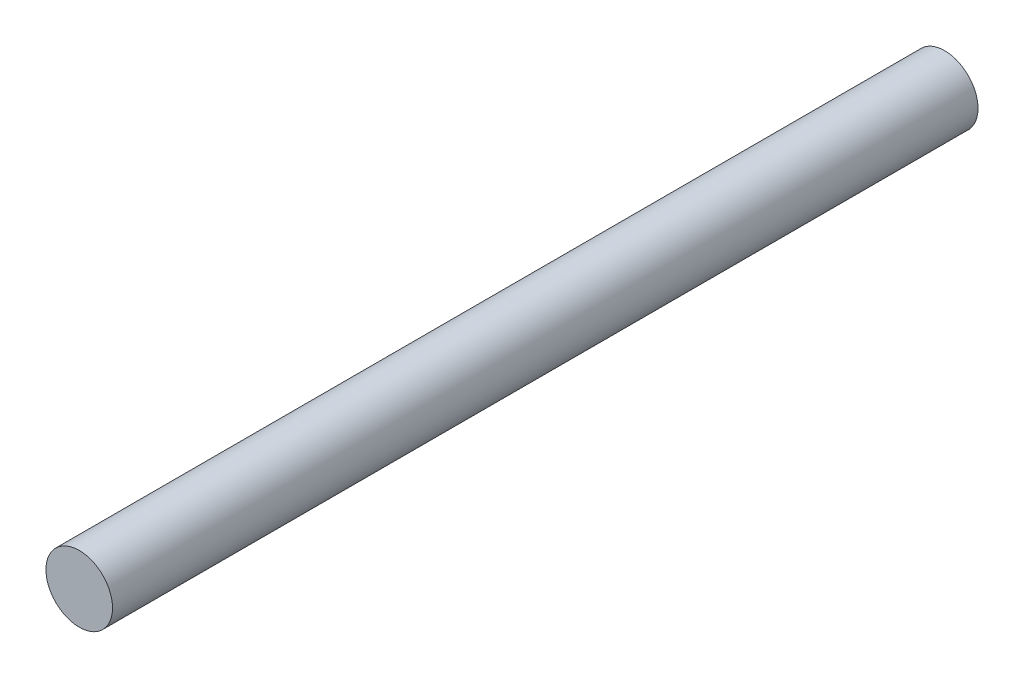
ISO-10303-21;
HEADER;
FILE_DESCRIPTION(('STEP AP214'),'2;1');
FILE_NAME('part.step','',(''),(''),'','','');
FILE_SCHEMA(('AUTOMOTIVE_DESIGN { 1 0 10303 214 1 1 1 1 }'));
ENDSEC;
DATA;
#1=APPLICATION_CONTEXT('core data for automotive mechanical design processes');
#2=APPLICATION_PROTOCOL_DEFINITION('international standard','automotive_design',2000,#1);
#3=PRODUCT_CONTEXT('',#1,'mechanical');
#4=PRODUCT('Part','Part','',(#3));
#5=PRODUCT_RELATED_PRODUCT_CATEGORY('part','',(#4));
#6=PRODUCT_DEFINITION_FORMATION('','',#4);
#7=PRODUCT_DEFINITION_CONTEXT('part definition',#1,'design');
#8=PRODUCT_DEFINITION('design','',#6,#7);
#9=PRODUCT_DEFINITION_SHAPE('','',#8);
#10=(LENGTH_UNIT() NAMED_UNIT(*) SI_UNIT(.MILLI.,.METRE.));
#11=(NAMED_UNIT(*) PLANE_ANGLE_UNIT() SI_UNIT($,.RADIAN.));
#12=(NAMED_UNIT(*) SI_UNIT($,.STERADIAN.) SOLID_ANGLE_UNIT());
#13=UNCERTAINTY_MEASURE_WITH_UNIT(LENGTH_MEASURE(1.E-05),#10,'distance_accuracy_value','');
#14=(GEOMETRIC_REPRESENTATION_CONTEXT(3) GLOBAL_UNCERTAINTY_ASSIGNED_CONTEXT((#13)) GLOBAL_UNIT_ASSIGNED_CONTEXT((#10,
#11,#12)) REPRESENTATION_CONTEXT('',''));
#15=CARTESIAN_POINT('',(0.,0.,0.));
#16=DIRECTION('',(0.,0.,1.));
#17=DIRECTION('',(1.,0.,0.));
#18=AXIS2_PLACEMENT_3D('',#15,#16,#17);
#19=CARTESIAN_POINT('',(0.,0.,130.));
#20=DIRECTION('',(0.,0.,-1.));
#21=DIRECTION('',(-1.,0.,0.));
#22=AXIS2_PLACEMENT_3D('',#19,#20,#21);
#23=CYLINDRICAL_SURFACE('',#22,5.);
#24=CARTESIAN_POINT('',(0.,0.,130.));
#25=DIRECTION('',(0.,0.,1.));
#26=DIRECTION('',(1.,0.,0.));
#27=AXIS2_PLACEMENT_3D('',#24,#25,#26);
#28=CIRCLE('',#27,5.);
#29=CARTESIAN_POINT('',(5.,0.,130.));
#30=VERTEX_POINT('',#29);
#31=EDGE_CURVE('E10',#30,#30,#28,.T.);
#32=ORIENTED_EDGE('',*,*,#31,.F.);
#33=EDGE_LOOP('',(#32));
#34=FACE_BOUND('',#33,.T.);
#35=CARTESIAN_POINT('',(0.,0.,0.));
#36=DIRECTION('',(0.,0.,1.));
#37=DIRECTION('',(1.,0.,0.));
#38=AXIS2_PLACEMENT_3D('',#35,#36,#37);
#39=CIRCLE('',#38,5.);
#40=CARTESIAN_POINT('',(5.,0.,0.));
#41=VERTEX_POINT('',#40);
#42=EDGE_CURVE('E40',#41,#41,#39,.T.);
#43=ORIENTED_EDGE('',*,*,#42,.T.);
#44=EDGE_LOOP('',(#43));
#45=FACE_BOUND('',#44,.T.);
#46=ADVANCED_FACE('F37',(#34,#45),#23,.T.);
#47=CARTESIAN_POINT('',(0.,0.,130.));
#48=DIRECTION('',(0.,0.,1.));
#49=DIRECTION('',(1.,0.,0.));
#50=AXIS2_PLACEMENT_3D('',#47,#48,#49);
#51=PLANE('',#50);
#52=ORIENTED_EDGE('',*,*,#31,.T.);
#53=EDGE_LOOP('',(#52));
#54=FACE_BOUND('',#53,.T.);
#55=ADVANCED_FACE('F54',(#54),#51,.T.);
#56=CARTESIAN_POINT('',(0.,0.,0.));
#57=DIRECTION('',(0.,0.,1.));
#58=DIRECTION('',(1.,0.,0.));
#59=AXIS2_PLACEMENT_3D('',#56,#57,#58);
#60=PLANE('',#59);
#61=ORIENTED_EDGE('',*,*,#42,.F.);
#62=EDGE_LOOP('',(#61));
#63=FACE_BOUND('',#62,.T.);
#64=ADVANCED_FACE('F52',(#63),#60,.F.);
#65=CLOSED_SHELL('',(#46,#55,#64));
#66=MANIFOLD_SOLID_BREP('B2',#65);
#67=ADVANCED_BREP_SHAPE_REPRESENTATION('',(#18,#66),#14);
#68=SHAPE_DEFINITION_REPRESENTATION(#9,#67);
ENDSEC;
END-ISO-10303-21;
